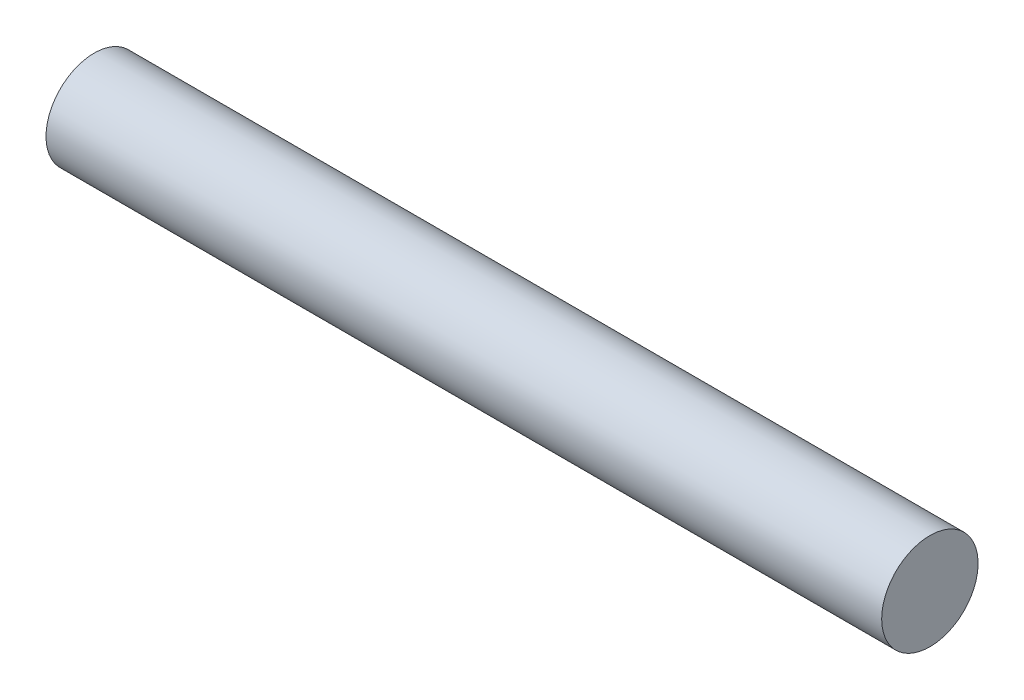
ISO-10303-21;
HEADER;
FILE_DESCRIPTION(('STEP AP214'),'2;1');
FILE_NAME('part.step','',(''),(''),'','','');
FILE_SCHEMA(('AUTOMOTIVE_DESIGN { 1 0 10303 214 1 1 1 1 }'));
ENDSEC;
DATA;
#1=APPLICATION_CONTEXT('core data for automotive mechanical design processes');
#2=APPLICATION_PROTOCOL_DEFINITION('international standard','automotive_design',2000,#1);
#3=PRODUCT_CONTEXT('',#1,'mechanical');
#4=PRODUCT('Part','Part','',(#3));
#5=PRODUCT_RELATED_PRODUCT_CATEGORY('part','',(#4));
#6=PRODUCT_DEFINITION_FORMATION('','',#4);
#7=PRODUCT_DEFINITION_CONTEXT('part definition',#1,'design');
#8=PRODUCT_DEFINITION('design','',#6,#7);
#9=PRODUCT_DEFINITION_SHAPE('','',#8);
#10=(LENGTH_UNIT() NAMED_UNIT(*) SI_UNIT(.MILLI.,.METRE.));
#11=(NAMED_UNIT(*) PLANE_ANGLE_UNIT() SI_UNIT($,.RADIAN.));
#12=(NAMED_UNIT(*) SI_UNIT($,.STERADIAN.) SOLID_ANGLE_UNIT());
#13=UNCERTAINTY_MEASURE_WITH_UNIT(LENGTH_MEASURE(1.E-05),#10,'distance_accuracy_value','');
#14=(GEOMETRIC_REPRESENTATION_CONTEXT(3) GLOBAL_UNCERTAINTY_ASSIGNED_CONTEXT((#13)) GLOBAL_UNIT_ASSIGNED_CONTEXT((#10,
#11,#12)) REPRESENTATION_CONTEXT('',''));
#15=CARTESIAN_POINT('',(0.,0.,0.));
#16=DIRECTION('',(0.,0.,1.));
#17=DIRECTION('',(1.,0.,0.));
#18=AXIS2_PLACEMENT_3D('',#15,#16,#17);
#19=CARTESIAN_POINT('',(13.,-0.75,0.));
#20=DIRECTION('',(-1.,0.,0.));
#21=DIRECTION('',(0.,0.,1.));
#22=AXIS2_PLACEMENT_3D('',#19,#20,#21);
#23=PLANE('',#22);
#24=CARTESIAN_POINT('',(13.,-0.75,0.));
#25=DIRECTION('',(-1.,0.,0.));
#26=DIRECTION('',(0.,0.,1.));
#27=AXIS2_PLACEMENT_3D('',#24,#25,#26);
#28=CIRCLE('',#27,1.5);
#29=CARTESIAN_POINT('',(13.,-0.75,1.5));
#30=VERTEX_POINT('',#29);
#31=EDGE_CURVE('E43',#30,#30,#28,.T.);
#32=ORIENTED_EDGE('',*,*,#31,.F.);
#33=EDGE_LOOP('',(#32));
#34=FACE_BOUND('',#33,.T.);
#35=ADVANCED_FACE('F37',(#34),#23,.F.);
#36=CARTESIAN_POINT('',(-13.,-0.75,0.));
#37=DIRECTION('',(1.,0.,0.));
#38=DIRECTION('',(0.,0.,-1.));
#39=AXIS2_PLACEMENT_3D('',#36,#37,#38);
#40=PLANE('',#39);
#41=CARTESIAN_POINT('',(-13.,-0.75,0.));
#42=DIRECTION('',(-1.,0.,0.));
#43=DIRECTION('',(0.,0.,1.));
#44=AXIS2_PLACEMENT_3D('',#41,#42,#43);
#45=CIRCLE('',#44,1.5);
#46=CARTESIAN_POINT('',(-13.,-0.75,1.5));
#47=VERTEX_POINT('',#46);
#48=EDGE_CURVE('E10',#47,#47,#45,.T.);
#49=ORIENTED_EDGE('',*,*,#48,.T.);
#50=EDGE_LOOP('',(#49));
#51=FACE_BOUND('',#50,.T.);
#52=ADVANCED_FACE('F52',(#51),#40,.F.);
#53=CARTESIAN_POINT('',(-13.,-0.75,0.));
#54=DIRECTION('',(-1.,0.,0.));
#55=DIRECTION('',(0.,0.,1.));
#56=AXIS2_PLACEMENT_3D('',#53,#54,#55);
#57=CYLINDRICAL_SURFACE('',#56,1.5);
#58=ORIENTED_EDGE('',*,*,#48,.F.);
#59=EDGE_LOOP('',(#58));
#60=FACE_BOUND('',#59,.T.);
#61=ORIENTED_EDGE('',*,*,#31,.T.);
#62=EDGE_LOOP('',(#61));
#63=FACE_BOUND('',#62,.T.);
#64=ADVANCED_FACE('F49',(#60,#63),#57,.T.);
#65=CLOSED_SHELL('',(#35,#52,#64));
#66=MANIFOLD_SOLID_BREP('B2',#65);
#67=ADVANCED_BREP_SHAPE_REPRESENTATION('',(#18,#66),#14);
#68=SHAPE_DEFINITION_REPRESENTATION(#9,#67);
ENDSEC;
END-ISO-10303-21;
